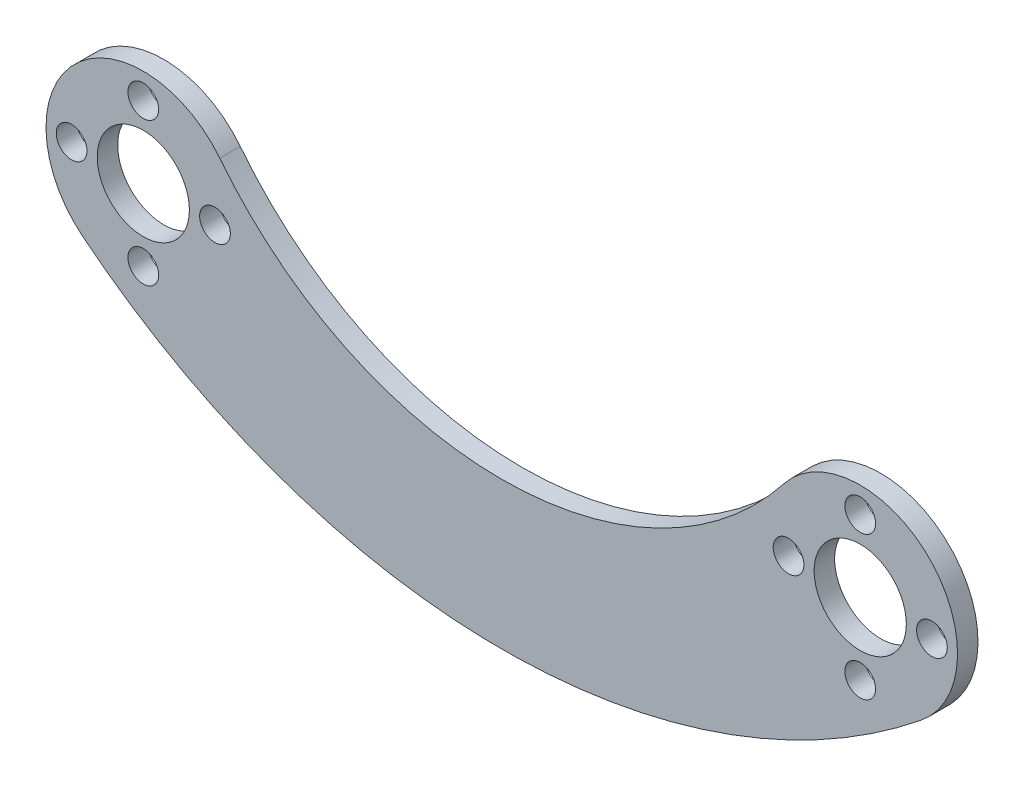
ISO-10303-21;
HEADER;
FILE_DESCRIPTION(('STEP AP214'),'2;1');
FILE_NAME('part.step','',(''),(''),'','','');
FILE_SCHEMA(('AUTOMOTIVE_DESIGN { 1 0 10303 214 1 1 1 1 }'));
ENDSEC;
DATA;
#1=APPLICATION_CONTEXT('core data for automotive mechanical design processes');
#2=APPLICATION_PROTOCOL_DEFINITION('international standard','automotive_design',2000,#1);
#3=PRODUCT_CONTEXT('',#1,'mechanical');
#4=PRODUCT('Part','Part','',(#3));
#5=PRODUCT_RELATED_PRODUCT_CATEGORY('part','',(#4));
#6=PRODUCT_DEFINITION_FORMATION('','',#4);
#7=PRODUCT_DEFINITION_CONTEXT('part definition',#1,'design');
#8=PRODUCT_DEFINITION('design','',#6,#7);
#9=PRODUCT_DEFINITION_SHAPE('','',#8);
#10=(LENGTH_UNIT() NAMED_UNIT(*) SI_UNIT(.MILLI.,.METRE.));
#11=(NAMED_UNIT(*) PLANE_ANGLE_UNIT() SI_UNIT($,.RADIAN.));
#12=(NAMED_UNIT(*) SI_UNIT($,.STERADIAN.) SOLID_ANGLE_UNIT());
#13=UNCERTAINTY_MEASURE_WITH_UNIT(LENGTH_MEASURE(1.E-05),#10,'distance_accuracy_value','');
#14=(GEOMETRIC_REPRESENTATION_CONTEXT(3) GLOBAL_UNCERTAINTY_ASSIGNED_CONTEXT((#13)) GLOBAL_UNIT_ASSIGNED_CONTEXT((#10,
#11,#12)) REPRESENTATION_CONTEXT('',''));
#15=CARTESIAN_POINT('',(0.,0.,0.));
#16=DIRECTION('',(0.,0.,1.));
#17=DIRECTION('',(1.,0.,0.));
#18=AXIS2_PLACEMENT_3D('',#15,#16,#17);
#19=CARTESIAN_POINT('',(0.,27.4818121673226,2.));
#20=DIRECTION('',(0.,0.,-1.));
#21=DIRECTION('',(-1.,0.,0.));
#22=AXIS2_PLACEMENT_3D('',#19,#20,#21);
#23=CYLINDRICAL_SURFACE('',#22,35.);
#24=CARTESIAN_POINT('',(0.,27.4818121673226,0.));
#25=DIRECTION('',(0.,0.,-1.));
#26=DIRECTION('',(1.,0.,0.));
#27=AXIS2_PLACEMENT_3D('',#24,#25,#26);
#28=CIRCLE('',#27,35.);
#29=CARTESIAN_POINT('',(27.5280898876405,5.86690372111381,0.));
#30=VERTEX_POINT('',#29);
#31=CARTESIAN_POINT('',(-27.5280898876404,5.86690372111381,0.));
#32=VERTEX_POINT('',#31);
#33=EDGE_CURVE('E107',#30,#32,#28,.T.);
#34=ORIENTED_EDGE('',*,*,#33,.T.);
#35=DIRECTION('',(0.,0.,-1.));
#36=VECTOR('',#35,1.);
#37=CARTESIAN_POINT('',(-27.5280898876404,5.86690372111381,2.));
#38=LINE('',#37,#36);
#39=CARTESIAN_POINT('',(-27.5280898876404,5.86690372111381,2.));
#40=VERTEX_POINT('',#39);
#41=EDGE_CURVE('E11',#40,#32,#38,.T.);
#42=ORIENTED_EDGE('',*,*,#41,.F.);
#43=CARTESIAN_POINT('',(0.,27.4818121673226,2.));
#44=DIRECTION('',(0.,0.,-1.));
#45=DIRECTION('',(1.,0.,0.));
#46=AXIS2_PLACEMENT_3D('',#43,#44,#45);
#47=CIRCLE('',#46,35.);
#48=CARTESIAN_POINT('',(27.5280898876405,5.86690372111381,2.));
#49=VERTEX_POINT('',#48);
#50=EDGE_CURVE('E91',#49,#40,#47,.T.);
#51=ORIENTED_EDGE('',*,*,#50,.F.);
#52=DIRECTION('',(0.,0.,-1.));
#53=VECTOR('',#52,1.);
#54=CARTESIAN_POINT('',(27.5280898876405,5.86690372111381,2.));
#55=LINE('',#54,#53);
#56=EDGE_CURVE('E103',#49,#30,#55,.T.);
#57=ORIENTED_EDGE('',*,*,#56,.T.);
#58=EDGE_LOOP('',(#34,#42,#51,#57));
#59=FACE_BOUND('',#58,.T.);
#60=ADVANCED_FACE('F39',(#59),#23,.F.);
#61=CARTESIAN_POINT('',(-35.,0.,2.));
#62=DIRECTION('',(0.,0.,-1.));
#63=DIRECTION('',(-1.,0.,0.));
#64=AXIS2_PLACEMENT_3D('',#61,#62,#63);
#65=CYLINDRICAL_SURFACE('',#64,9.5);
#66=CARTESIAN_POINT('',(-35.,0.,0.));
#67=DIRECTION('',(0.,0.,1.));
#68=DIRECTION('',(1.,0.,0.));
#69=AXIS2_PLACEMENT_3D('',#66,#67,#68);
#70=CIRCLE('',#69,9.5);
#71=CARTESIAN_POINT('',(-40.9709056315738,-7.38906529534286,0.));
#72=VERTEX_POINT('',#71);
#73=EDGE_CURVE('E96',#32,#72,#70,.T.);
#74=ORIENTED_EDGE('',*,*,#73,.T.);
#75=DIRECTION('',(0.,0.,-1.));
#76=VECTOR('',#75,1.);
#77=CARTESIAN_POINT('',(-40.9709056315738,-7.38906529534286,2.));
#78=LINE('',#77,#76);
#79=CARTESIAN_POINT('',(-40.9709056315738,-7.38906529534286,2.));
#80=VERTEX_POINT('',#79);
#81=EDGE_CURVE('E48',#80,#72,#78,.T.);
#82=ORIENTED_EDGE('',*,*,#81,.F.);
#83=CARTESIAN_POINT('',(-35.,0.,2.));
#84=DIRECTION('',(0.,0.,1.));
#85=DIRECTION('',(1.,0.,0.));
#86=AXIS2_PLACEMENT_3D('',#83,#84,#85);
#87=CIRCLE('',#86,9.5);
#88=EDGE_CURVE('E86',#40,#80,#87,.T.);
#89=ORIENTED_EDGE('',*,*,#88,.F.);
#90=ORIENTED_EDGE('',*,*,#41,.T.);
#91=EDGE_LOOP('',(#74,#82,#89,#90));
#92=FACE_BOUND('',#91,.T.);
#93=ADVANCED_FACE('F95',(#92),#65,.T.);
#94=CARTESIAN_POINT('',(0.,43.312907839214,2.));
#95=DIRECTION('',(0.,0.,-1.));
#96=DIRECTION('',(-1.,0.,0.));
#97=AXIS2_PLACEMENT_3D('',#94,#95,#96);
#98=CYLINDRICAL_SURFACE('',#97,65.186694869495);
#99=CARTESIAN_POINT('',(0.,43.312907839214,0.));
#100=DIRECTION('',(0.,0.,1.));
#101=DIRECTION('',(1.,0.,0.));
#102=AXIS2_PLACEMENT_3D('',#99,#100,#101);
#103=CIRCLE('',#102,65.186694869495);
#104=CARTESIAN_POINT('',(40.9709056315738,-7.38906529534288,0.));
#105=VERTEX_POINT('',#104);
#106=EDGE_CURVE('E73',#72,#105,#103,.T.);
#107=ORIENTED_EDGE('',*,*,#106,.T.);
#108=DIRECTION('',(0.,0.,-1.));
#109=VECTOR('',#108,1.);
#110=CARTESIAN_POINT('',(40.9709056315738,-7.38906529534288,2.));
#111=LINE('',#110,#109);
#112=CARTESIAN_POINT('',(40.9709056315738,-7.38906529534288,2.));
#113=VERTEX_POINT('',#112);
#114=EDGE_CURVE('E98',#113,#105,#111,.T.);
#115=ORIENTED_EDGE('',*,*,#114,.F.);
#116=CARTESIAN_POINT('',(0.,43.312907839214,2.));
#117=DIRECTION('',(0.,0.,1.));
#118=DIRECTION('',(1.,0.,0.));
#119=AXIS2_PLACEMENT_3D('',#116,#117,#118);
#120=CIRCLE('',#119,65.186694869495);
#121=EDGE_CURVE('E89',#80,#113,#120,.T.);
#122=ORIENTED_EDGE('',*,*,#121,.F.);
#123=ORIENTED_EDGE('',*,*,#81,.T.);
#124=EDGE_LOOP('',(#107,#115,#122,#123));
#125=FACE_BOUND('',#124,.T.);
#126=ADVANCED_FACE('F99',(#125),#98,.T.);
#127=CARTESIAN_POINT('',(35.,0.,2.));
#128=DIRECTION('',(0.,0.,-1.));
#129=DIRECTION('',(-1.,0.,0.));
#130=AXIS2_PLACEMENT_3D('',#127,#128,#129);
#131=CYLINDRICAL_SURFACE('',#130,9.5);
#132=CARTESIAN_POINT('',(35.,0.,0.));
#133=DIRECTION('',(0.,0.,1.));
#134=DIRECTION('',(1.,0.,0.));
#135=AXIS2_PLACEMENT_3D('',#132,#133,#134);
#136=CIRCLE('',#135,9.5);
#137=EDGE_CURVE('E79',#105,#30,#136,.T.);
#138=ORIENTED_EDGE('',*,*,#137,.T.);
#139=ORIENTED_EDGE('',*,*,#56,.F.);
#140=CARTESIAN_POINT('',(35.,0.,2.));
#141=DIRECTION('',(0.,0.,1.));
#142=DIRECTION('',(1.,0.,0.));
#143=AXIS2_PLACEMENT_3D('',#140,#141,#142);
#144=CIRCLE('',#143,9.5);
#145=EDGE_CURVE('E56',#113,#49,#144,.T.);
#146=ORIENTED_EDGE('',*,*,#145,.F.);
#147=ORIENTED_EDGE('',*,*,#114,.T.);
#148=EDGE_LOOP('',(#138,#139,#146,#147));
#149=FACE_BOUND('',#148,.T.);
#150=ADVANCED_FACE('F121',(#149),#131,.T.);
#151=CARTESIAN_POINT('',(17.5,13.7409060836613,2.));
#152=DIRECTION('',(0.,0.,1.));
#153=DIRECTION('',(1.,0.,0.));
#154=AXIS2_PLACEMENT_3D('',#151,#152,#153);
#155=PLANE('',#154);
#156=CARTESIAN_POINT('',(42.,0.,2.));
#157=DIRECTION('',(0.,0.,1.));
#158=DIRECTION('',(1.,0.,0.));
#159=AXIS2_PLACEMENT_3D('',#156,#157,#158);
#160=CIRCLE('',#159,1.5);
#161=CARTESIAN_POINT('',(43.5,0.,2.));
#162=VERTEX_POINT('',#161);
#163=EDGE_CURVE('E168',#162,#162,#160,.T.);
#164=ORIENTED_EDGE('',*,*,#163,.F.);
#165=EDGE_LOOP('',(#164));
#166=FACE_BOUND('',#165,.T.);
#167=CARTESIAN_POINT('',(35.,7.00000000000001,2.));
#168=DIRECTION('',(0.,0.,1.));
#169=DIRECTION('',(1.,0.,0.));
#170=AXIS2_PLACEMENT_3D('',#167,#168,#169);
#171=CIRCLE('',#170,1.5);
#172=CARTESIAN_POINT('',(36.5,7.00000000000001,2.));
#173=VERTEX_POINT('',#172);
#174=EDGE_CURVE('E177',#173,#173,#171,.T.);
#175=ORIENTED_EDGE('',*,*,#174,.F.);
#176=EDGE_LOOP('',(#175));
#177=FACE_BOUND('',#176,.T.);
#178=CARTESIAN_POINT('',(-34.9999999999999,7.,2.));
#179=DIRECTION('',(0.,0.,1.));
#180=DIRECTION('',(1.,0.,0.));
#181=AXIS2_PLACEMENT_3D('',#178,#179,#180);
#182=CIRCLE('',#181,1.5);
#183=CARTESIAN_POINT('',(-33.4999999999999,7.,2.));
#184=VERTEX_POINT('',#183);
#185=EDGE_CURVE('E185',#184,#184,#182,.T.);
#186=ORIENTED_EDGE('',*,*,#185,.F.);
#187=EDGE_LOOP('',(#186));
#188=FACE_BOUND('',#187,.T.);
#189=CARTESIAN_POINT('',(-42.,0.,2.));
#190=DIRECTION('',(0.,0.,1.));
#191=DIRECTION('',(1.,0.,0.));
#192=AXIS2_PLACEMENT_3D('',#189,#190,#191);
#193=CIRCLE('',#192,1.5);
#194=CARTESIAN_POINT('',(-40.5,0.,2.));
#195=VERTEX_POINT('',#194);
#196=EDGE_CURVE('E193',#195,#195,#193,.T.);
#197=ORIENTED_EDGE('',*,*,#196,.F.);
#198=EDGE_LOOP('',(#197));
#199=FACE_BOUND('',#198,.T.);
#200=CARTESIAN_POINT('',(35.,0.,2.));
#201=DIRECTION('',(0.,0.,1.));
#202=DIRECTION('',(1.,0.,0.));
#203=AXIS2_PLACEMENT_3D('',#200,#201,#202);
#204=CIRCLE('',#203,4.5);
#205=CARTESIAN_POINT('',(39.5,0.,2.));
#206=VERTEX_POINT('',#205);
#207=EDGE_CURVE('E145',#206,#206,#204,.T.);
#208=ORIENTED_EDGE('',*,*,#207,.F.);
#209=EDGE_LOOP('',(#208));
#210=FACE_BOUND('',#209,.T.);
#211=CARTESIAN_POINT('',(-28.,0.,2.));
#212=DIRECTION('',(0.,0.,1.));
#213=DIRECTION('',(1.,0.,0.));
#214=AXIS2_PLACEMENT_3D('',#211,#212,#213);
#215=CIRCLE('',#214,1.5);
#216=CARTESIAN_POINT('',(-26.5,0.,2.));
#217=VERTEX_POINT('',#216);
#218=EDGE_CURVE('E136',#217,#217,#215,.T.);
#219=ORIENTED_EDGE('',*,*,#218,.F.);
#220=EDGE_LOOP('',(#219));
#221=FACE_BOUND('',#220,.T.);
#222=CARTESIAN_POINT('',(28.,0.,2.));
#223=DIRECTION('',(0.,0.,1.));
#224=DIRECTION('',(1.,0.,0.));
#225=AXIS2_PLACEMENT_3D('',#222,#223,#224);
#226=CIRCLE('',#225,1.5);
#227=CARTESIAN_POINT('',(29.5,0.,2.));
#228=VERTEX_POINT('',#227);
#229=EDGE_CURVE('E161',#228,#228,#226,.T.);
#230=ORIENTED_EDGE('',*,*,#229,.F.);
#231=EDGE_LOOP('',(#230));
#232=FACE_BOUND('',#231,.T.);
#233=CARTESIAN_POINT('',(-35.,-7.00000000000001,2.));
#234=DIRECTION('',(0.,0.,1.));
#235=DIRECTION('',(1.,0.,0.));
#236=AXIS2_PLACEMENT_3D('',#233,#234,#235);
#237=CIRCLE('',#236,1.5);
#238=CARTESIAN_POINT('',(-33.5,-7.00000000000001,2.));
#239=VERTEX_POINT('',#238);
#240=EDGE_CURVE('E152',#239,#239,#237,.T.);
#241=ORIENTED_EDGE('',*,*,#240,.F.);
#242=EDGE_LOOP('',(#241));
#243=FACE_BOUND('',#242,.T.);
#244=CARTESIAN_POINT('',(34.9999999999999,-7.,2.));
#245=DIRECTION('',(0.,0.,1.));
#246=DIRECTION('',(1.,0.,0.));
#247=AXIS2_PLACEMENT_3D('',#244,#245,#246);
#248=CIRCLE('',#247,1.5);
#249=CARTESIAN_POINT('',(36.4999999999999,-7.,2.));
#250=VERTEX_POINT('',#249);
#251=EDGE_CURVE('E200',#250,#250,#248,.T.);
#252=ORIENTED_EDGE('',*,*,#251,.F.);
#253=EDGE_LOOP('',(#252));
#254=FACE_BOUND('',#253,.T.);
#255=CARTESIAN_POINT('',(-35.,0.,2.));
#256=DIRECTION('',(0.,0.,1.));
#257=DIRECTION('',(1.,0.,0.));
#258=AXIS2_PLACEMENT_3D('',#255,#256,#257);
#259=CIRCLE('',#258,4.5);
#260=CARTESIAN_POINT('',(-30.5,0.,2.));
#261=VERTEX_POINT('',#260);
#262=EDGE_CURVE('E128',#261,#261,#259,.T.);
#263=ORIENTED_EDGE('',*,*,#262,.F.);
#264=EDGE_LOOP('',(#263));
#265=FACE_BOUND('',#264,.T.);
#266=ORIENTED_EDGE('',*,*,#50,.T.);
#267=ORIENTED_EDGE('',*,*,#88,.T.);
#268=ORIENTED_EDGE('',*,*,#121,.T.);
#269=ORIENTED_EDGE('',*,*,#145,.T.);
#270=EDGE_LOOP('',(#266,#267,#268,#269));
#271=FACE_BOUND('',#270,.T.);
#272=ADVANCED_FACE('F87',(#166,#177,#188,#199,#210,#221,#232,#243,#254,#265,#271),#155,.T.);
#273=CARTESIAN_POINT('',(17.5,13.7409060836613,0.));
#274=DIRECTION('',(0.,0.,1.));
#275=DIRECTION('',(1.,0.,0.));
#276=AXIS2_PLACEMENT_3D('',#273,#274,#275);
#277=PLANE('',#276);
#278=CARTESIAN_POINT('',(42.,0.,0.));
#279=DIRECTION('',(0.,0.,1.));
#280=DIRECTION('',(1.,0.,0.));
#281=AXIS2_PLACEMENT_3D('',#278,#279,#280);
#282=CIRCLE('',#281,1.5);
#283=CARTESIAN_POINT('',(43.5,0.,0.));
#284=VERTEX_POINT('',#283);
#285=EDGE_CURVE('E172',#284,#284,#282,.T.);
#286=ORIENTED_EDGE('',*,*,#285,.T.);
#287=EDGE_LOOP('',(#286));
#288=FACE_BOUND('',#287,.T.);
#289=CARTESIAN_POINT('',(35.,7.00000000000001,0.));
#290=DIRECTION('',(0.,0.,1.));
#291=DIRECTION('',(1.,0.,0.));
#292=AXIS2_PLACEMENT_3D('',#289,#290,#291);
#293=CIRCLE('',#292,1.5);
#294=CARTESIAN_POINT('',(36.5,7.00000000000001,0.));
#295=VERTEX_POINT('',#294);
#296=EDGE_CURVE('E181',#295,#295,#293,.T.);
#297=ORIENTED_EDGE('',*,*,#296,.T.);
#298=EDGE_LOOP('',(#297));
#299=FACE_BOUND('',#298,.T.);
#300=CARTESIAN_POINT('',(-34.9999999999999,7.,0.));
#301=DIRECTION('',(0.,0.,1.));
#302=DIRECTION('',(1.,0.,0.));
#303=AXIS2_PLACEMENT_3D('',#300,#301,#302);
#304=CIRCLE('',#303,1.5);
#305=CARTESIAN_POINT('',(-33.4999999999999,7.,0.));
#306=VERTEX_POINT('',#305);
#307=EDGE_CURVE('E189',#306,#306,#304,.T.);
#308=ORIENTED_EDGE('',*,*,#307,.T.);
#309=EDGE_LOOP('',(#308));
#310=FACE_BOUND('',#309,.T.);
#311=CARTESIAN_POINT('',(-42.,0.,0.));
#312=DIRECTION('',(0.,0.,1.));
#313=DIRECTION('',(1.,0.,0.));
#314=AXIS2_PLACEMENT_3D('',#311,#312,#313);
#315=CIRCLE('',#314,1.5);
#316=CARTESIAN_POINT('',(-40.5,0.,0.));
#317=VERTEX_POINT('',#316);
#318=EDGE_CURVE('E157',#317,#317,#315,.T.);
#319=ORIENTED_EDGE('',*,*,#318,.T.);
#320=EDGE_LOOP('',(#319));
#321=FACE_BOUND('',#320,.T.);
#322=CARTESIAN_POINT('',(35.,0.,0.));
#323=DIRECTION('',(0.,0.,1.));
#324=DIRECTION('',(1.,0.,0.));
#325=AXIS2_PLACEMENT_3D('',#322,#323,#324);
#326=CIRCLE('',#325,4.5);
#327=CARTESIAN_POINT('',(39.5,0.,0.));
#328=VERTEX_POINT('',#327);
#329=EDGE_CURVE('E132',#328,#328,#326,.T.);
#330=ORIENTED_EDGE('',*,*,#329,.T.);
#331=EDGE_LOOP('',(#330));
#332=FACE_BOUND('',#331,.T.);
#333=CARTESIAN_POINT('',(-28.,0.,0.));
#334=DIRECTION('',(0.,0.,1.));
#335=DIRECTION('',(1.,0.,0.));
#336=AXIS2_PLACEMENT_3D('',#333,#334,#335);
#337=CIRCLE('',#336,1.5);
#338=CARTESIAN_POINT('',(-26.5,0.,0.));
#339=VERTEX_POINT('',#338);
#340=EDGE_CURVE('E140',#339,#339,#337,.T.);
#341=ORIENTED_EDGE('',*,*,#340,.T.);
#342=EDGE_LOOP('',(#341));
#343=FACE_BOUND('',#342,.T.);
#344=CARTESIAN_POINT('',(28.,0.,0.));
#345=DIRECTION('',(0.,0.,1.));
#346=DIRECTION('',(1.,0.,0.));
#347=AXIS2_PLACEMENT_3D('',#344,#345,#346);
#348=CIRCLE('',#347,1.5);
#349=CARTESIAN_POINT('',(29.5,0.,0.));
#350=VERTEX_POINT('',#349);
#351=EDGE_CURVE('E141',#350,#350,#348,.T.);
#352=ORIENTED_EDGE('',*,*,#351,.T.);
#353=EDGE_LOOP('',(#352));
#354=FACE_BOUND('',#353,.T.);
#355=CARTESIAN_POINT('',(-35.,-7.00000000000001,0.));
#356=DIRECTION('',(0.,0.,1.));
#357=DIRECTION('',(1.,0.,0.));
#358=AXIS2_PLACEMENT_3D('',#355,#356,#357);
#359=CIRCLE('',#358,1.5);
#360=CARTESIAN_POINT('',(-33.5,-7.00000000000001,0.));
#361=VERTEX_POINT('',#360);
#362=EDGE_CURVE('E156',#361,#361,#359,.T.);
#363=ORIENTED_EDGE('',*,*,#362,.T.);
#364=EDGE_LOOP('',(#363));
#365=FACE_BOUND('',#364,.T.);
#366=CARTESIAN_POINT('',(34.9999999999999,-7.,0.));
#367=DIRECTION('',(0.,0.,1.));
#368=DIRECTION('',(1.,0.,0.));
#369=AXIS2_PLACEMENT_3D('',#366,#367,#368);
#370=CIRCLE('',#369,1.5);
#371=CARTESIAN_POINT('',(36.4999999999999,-7.,0.));
#372=VERTEX_POINT('',#371);
#373=EDGE_CURVE('E173',#372,#372,#370,.T.);
#374=ORIENTED_EDGE('',*,*,#373,.T.);
#375=EDGE_LOOP('',(#374));
#376=FACE_BOUND('',#375,.T.);
#377=CARTESIAN_POINT('',(-35.,0.,0.));
#378=DIRECTION('',(0.,0.,1.));
#379=DIRECTION('',(1.,0.,0.));
#380=AXIS2_PLACEMENT_3D('',#377,#378,#379);
#381=CIRCLE('',#380,4.5);
#382=CARTESIAN_POINT('',(-30.5,0.,0.));
#383=VERTEX_POINT('',#382);
#384=EDGE_CURVE('E111',#383,#383,#381,.T.);
#385=ORIENTED_EDGE('',*,*,#384,.T.);
#386=EDGE_LOOP('',(#385));
#387=FACE_BOUND('',#386,.T.);
#388=ORIENTED_EDGE('',*,*,#33,.F.);
#389=ORIENTED_EDGE('',*,*,#137,.F.);
#390=ORIENTED_EDGE('',*,*,#106,.F.);
#391=ORIENTED_EDGE('',*,*,#73,.F.);
#392=EDGE_LOOP('',(#388,#389,#390,#391));
#393=FACE_BOUND('',#392,.T.);
#394=ADVANCED_FACE('F124',(#288,#299,#310,#321,#332,#343,#354,#365,#376,#387,#393),#277,.F.);
#395=CARTESIAN_POINT('',(-35.,0.,0.));
#396=DIRECTION('',(0.,0.,1.));
#397=DIRECTION('',(1.,0.,0.));
#398=AXIS2_PLACEMENT_3D('',#395,#396,#397);
#399=CYLINDRICAL_SURFACE('',#398,4.5);
#400=ORIENTED_EDGE('',*,*,#384,.F.);
#401=EDGE_LOOP('',(#400));
#402=FACE_BOUND('',#401,.T.);
#403=ORIENTED_EDGE('',*,*,#262,.T.);
#404=EDGE_LOOP('',(#403));
#405=FACE_BOUND('',#404,.T.);
#406=ADVANCED_FACE('F214',(#402,#405),#399,.F.);
#407=CARTESIAN_POINT('',(34.9999999999999,-7.,0.));
#408=DIRECTION('',(0.,0.,1.));
#409=DIRECTION('',(1.,0.,0.));
#410=AXIS2_PLACEMENT_3D('',#407,#408,#409);
#411=CYLINDRICAL_SURFACE('',#410,1.5);
#412=ORIENTED_EDGE('',*,*,#373,.F.);
#413=EDGE_LOOP('',(#412));
#414=FACE_BOUND('',#413,.T.);
#415=ORIENTED_EDGE('',*,*,#251,.T.);
#416=EDGE_LOOP('',(#415));
#417=FACE_BOUND('',#416,.T.);
#418=ADVANCED_FACE('F210',(#414,#417),#411,.F.);
#419=CARTESIAN_POINT('',(-35.,-7.00000000000001,0.));
#420=DIRECTION('',(0.,0.,1.));
#421=DIRECTION('',(1.,0.,0.));
#422=AXIS2_PLACEMENT_3D('',#419,#420,#421);
#423=CYLINDRICAL_SURFACE('',#422,1.5);
#424=ORIENTED_EDGE('',*,*,#362,.F.);
#425=EDGE_LOOP('',(#424));
#426=FACE_BOUND('',#425,.T.);
#427=ORIENTED_EDGE('',*,*,#240,.T.);
#428=EDGE_LOOP('',(#427));
#429=FACE_BOUND('',#428,.T.);
#430=ADVANCED_FACE('F213',(#426,#429),#423,.F.);
#431=CARTESIAN_POINT('',(28.,0.,0.));
#432=DIRECTION('',(0.,0.,1.));
#433=DIRECTION('',(1.,0.,0.));
#434=AXIS2_PLACEMENT_3D('',#431,#432,#433);
#435=CYLINDRICAL_SURFACE('',#434,1.5);
#436=ORIENTED_EDGE('',*,*,#351,.F.);
#437=EDGE_LOOP('',(#436));
#438=FACE_BOUND('',#437,.T.);
#439=ORIENTED_EDGE('',*,*,#229,.T.);
#440=EDGE_LOOP('',(#439));
#441=FACE_BOUND('',#440,.T.);
#442=ADVANCED_FACE('F275',(#438,#441),#435,.F.);
#443=CARTESIAN_POINT('',(-28.,0.,0.));
#444=DIRECTION('',(0.,0.,1.));
#445=DIRECTION('',(1.,0.,0.));
#446=AXIS2_PLACEMENT_3D('',#443,#444,#445);
#447=CYLINDRICAL_SURFACE('',#446,1.5);
#448=ORIENTED_EDGE('',*,*,#340,.F.);
#449=EDGE_LOOP('',(#448));
#450=FACE_BOUND('',#449,.T.);
#451=ORIENTED_EDGE('',*,*,#218,.T.);
#452=EDGE_LOOP('',(#451));
#453=FACE_BOUND('',#452,.T.);
#454=ADVANCED_FACE('F285',(#450,#453),#447,.F.);
#455=CARTESIAN_POINT('',(35.,0.,0.));
#456=DIRECTION('',(0.,0.,1.));
#457=DIRECTION('',(1.,0.,0.));
#458=AXIS2_PLACEMENT_3D('',#455,#456,#457);
#459=CYLINDRICAL_SURFACE('',#458,4.5);
#460=ORIENTED_EDGE('',*,*,#329,.F.);
#461=EDGE_LOOP('',(#460));
#462=FACE_BOUND('',#461,.T.);
#463=ORIENTED_EDGE('',*,*,#207,.T.);
#464=EDGE_LOOP('',(#463));
#465=FACE_BOUND('',#464,.T.);
#466=ADVANCED_FACE('F295',(#462,#465),#459,.F.);
#467=CARTESIAN_POINT('',(-42.,0.,0.));
#468=DIRECTION('',(0.,0.,1.));
#469=DIRECTION('',(1.,0.,0.));
#470=AXIS2_PLACEMENT_3D('',#467,#468,#469);
#471=CYLINDRICAL_SURFACE('',#470,1.5);
#472=ORIENTED_EDGE('',*,*,#318,.F.);
#473=EDGE_LOOP('',(#472));
#474=FACE_BOUND('',#473,.T.);
#475=ORIENTED_EDGE('',*,*,#196,.T.);
#476=EDGE_LOOP('',(#475));
#477=FACE_BOUND('',#476,.T.);
#478=ADVANCED_FACE('F304',(#474,#477),#471,.F.);
#479=CARTESIAN_POINT('',(-34.9999999999999,7.,0.));
#480=DIRECTION('',(0.,0.,1.));
#481=DIRECTION('',(1.,0.,0.));
#482=AXIS2_PLACEMENT_3D('',#479,#480,#481);
#483=CYLINDRICAL_SURFACE('',#482,1.5);
#484=ORIENTED_EDGE('',*,*,#307,.F.);
#485=EDGE_LOOP('',(#484));
#486=FACE_BOUND('',#485,.T.);
#487=ORIENTED_EDGE('',*,*,#185,.T.);
#488=EDGE_LOOP('',(#487));
#489=FACE_BOUND('',#488,.T.);
#490=ADVANCED_FACE('F314',(#486,#489),#483,.F.);
#491=CARTESIAN_POINT('',(35.,7.00000000000001,0.));
#492=DIRECTION('',(0.,0.,1.));
#493=DIRECTION('',(1.,0.,0.));
#494=AXIS2_PLACEMENT_3D('',#491,#492,#493);
#495=CYLINDRICAL_SURFACE('',#494,1.5);
#496=ORIENTED_EDGE('',*,*,#296,.F.);
#497=EDGE_LOOP('',(#496));
#498=FACE_BOUND('',#497,.T.);
#499=ORIENTED_EDGE('',*,*,#174,.T.);
#500=EDGE_LOOP('',(#499));
#501=FACE_BOUND('',#500,.T.);
#502=ADVANCED_FACE('F324',(#498,#501),#495,.F.);
#503=CARTESIAN_POINT('',(42.,0.,0.));
#504=DIRECTION('',(0.,0.,1.));
#505=DIRECTION('',(1.,0.,0.));
#506=AXIS2_PLACEMENT_3D('',#503,#504,#505);
#507=CYLINDRICAL_SURFACE('',#506,1.5);
#508=ORIENTED_EDGE('',*,*,#285,.F.);
#509=EDGE_LOOP('',(#508));
#510=FACE_BOUND('',#509,.T.);
#511=ORIENTED_EDGE('',*,*,#163,.T.);
#512=EDGE_LOOP('',(#511));
#513=FACE_BOUND('',#512,.T.);
#514=ADVANCED_FACE('F334',(#510,#513),#507,.F.);
#515=CLOSED_SHELL('',(#60,#93,#126,#150,#272,#394,#406,#418,#430,#442,#454,#466,#478,#490,#502,#514));
#516=MANIFOLD_SOLID_BREP('B2',#515);
#517=ADVANCED_BREP_SHAPE_REPRESENTATION('',(#18,#516),#14);
#518=SHAPE_DEFINITION_REPRESENTATION(#9,#517);
ENDSEC;
END-ISO-10303-21;
